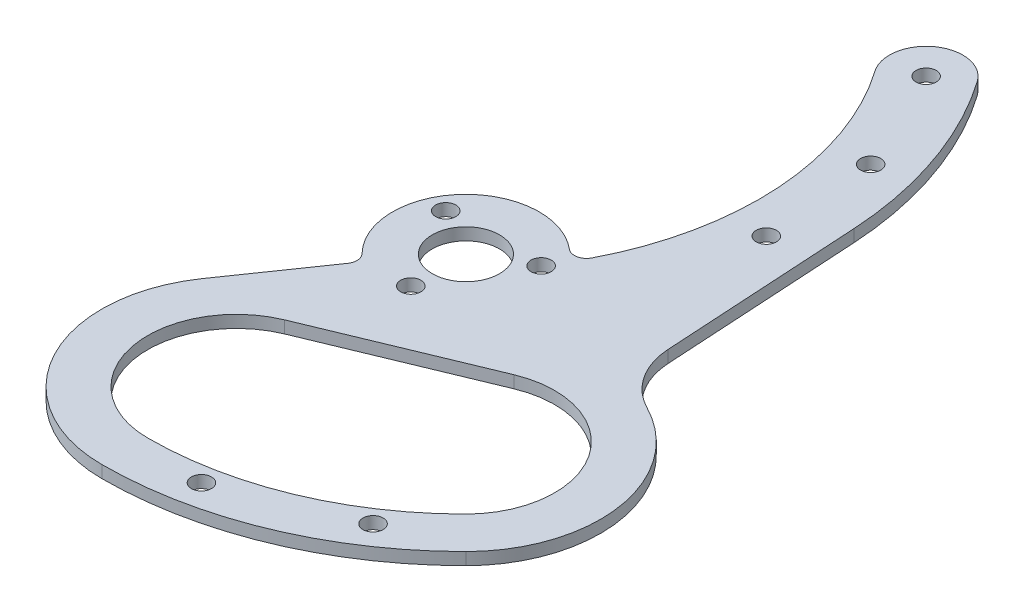
ISO-10303-21;
HEADER;
FILE_DESCRIPTION(('STEP AP214'),'2;1');
FILE_NAME('part.step','',(''),(''),'','','');
FILE_SCHEMA(('AUTOMOTIVE_DESIGN { 1 0 10303 214 1 1 1 1 }'));
ENDSEC;
DATA;
#1=APPLICATION_CONTEXT('core data for automotive mechanical design processes');
#2=APPLICATION_PROTOCOL_DEFINITION('international standard','automotive_design',2000,#1);
#3=PRODUCT_CONTEXT('',#1,'mechanical');
#4=PRODUCT('Part','Part','',(#3));
#5=PRODUCT_RELATED_PRODUCT_CATEGORY('part','',(#4));
#6=PRODUCT_DEFINITION_FORMATION('','',#4);
#7=PRODUCT_DEFINITION_CONTEXT('part definition',#1,'design');
#8=PRODUCT_DEFINITION('design','',#6,#7);
#9=PRODUCT_DEFINITION_SHAPE('','',#8);
#10=(LENGTH_UNIT() NAMED_UNIT(*) SI_UNIT(.MILLI.,.METRE.));
#11=(NAMED_UNIT(*) PLANE_ANGLE_UNIT() SI_UNIT($,.RADIAN.));
#12=(NAMED_UNIT(*) SI_UNIT($,.STERADIAN.) SOLID_ANGLE_UNIT());
#13=UNCERTAINTY_MEASURE_WITH_UNIT(LENGTH_MEASURE(1.E-05),#10,'distance_accuracy_value','');
#14=(GEOMETRIC_REPRESENTATION_CONTEXT(3) GLOBAL_UNCERTAINTY_ASSIGNED_CONTEXT((#13)) GLOBAL_UNIT_ASSIGNED_CONTEXT((#10,
#11,#12)) REPRESENTATION_CONTEXT('',''));
#15=CARTESIAN_POINT('',(0.,0.,0.));
#16=DIRECTION('',(0.,0.,1.));
#17=DIRECTION('',(1.,0.,0.));
#18=AXIS2_PLACEMENT_3D('',#15,#16,#17);
#19=CARTESIAN_POINT('',(12.4144052382109,2.,-62.7929327163513));
#20=DIRECTION('',(0.,-1.,0.));
#21=DIRECTION('',(0.,0.,-1.));
#22=AXIS2_PLACEMENT_3D('',#19,#20,#21);
#23=PLANE('',#22);
#24=CARTESIAN_POINT('',(12.4144052382108,2.,-62.7929327163513));
#25=DIRECTION('',(0.,-1.,0.));
#26=DIRECTION('',(0.,0.,-1.));
#27=AXIS2_PLACEMENT_3D('',#24,#25,#26);
#28=CIRCLE('',#27,1.65000000000008);
#29=CARTESIAN_POINT('',(12.4144052382108,2.,-64.4429327163514));
#30=VERTEX_POINT('',#29);
#31=EDGE_CURVE('E483',#30,#30,#28,.T.);
#32=ORIENTED_EDGE('',*,*,#31,.T.);
#33=EDGE_LOOP('',(#32));
#34=FACE_BOUND('',#33,.T.);
#35=CARTESIAN_POINT('',(20.340189466215,2.,-45.7960335889309));
#36=DIRECTION('',(0.,-1.,0.));
#37=DIRECTION('',(0.,0.,-1.));
#38=AXIS2_PLACEMENT_3D('',#35,#36,#37);
#39=CIRCLE('',#38,1.64999999999996);
#40=CARTESIAN_POINT('',(20.340189466215,2.,-47.4460335889308));
#41=VERTEX_POINT('',#40);
#42=EDGE_CURVE('E488',#41,#41,#39,.T.);
#43=ORIENTED_EDGE('',*,*,#42,.T.);
#44=EDGE_LOOP('',(#43));
#45=FACE_BOUND('',#44,.T.);
#46=CARTESIAN_POINT('',(21.9747085435597,2.,-27.1133950450212));
#47=DIRECTION('',(0.,-1.,0.));
#48=DIRECTION('',(0.,0.,-1.));
#49=AXIS2_PLACEMENT_3D('',#46,#47,#48);
#50=CIRCLE('',#49,1.65);
#51=CARTESIAN_POINT('',(21.9747085435597,2.,-28.7633950450212));
#52=VERTEX_POINT('',#51);
#53=EDGE_CURVE('E443',#52,#52,#50,.T.);
#54=ORIENTED_EDGE('',*,*,#53,.T.);
#55=EDGE_LOOP('',(#54));
#56=FACE_BOUND('',#55,.T.);
#57=CARTESIAN_POINT('',(30.556362816078,2.,45.7308286766401));
#58=DIRECTION('',(0.,1.,0.));
#59=DIRECTION('',(0.,0.,-1.));
#60=AXIS2_PLACEMENT_3D('',#57,#58,#59);
#61=CIRCLE('',#60,1.65);
#62=CARTESIAN_POINT('',(30.556362816078,2.,44.0808286766401));
#63=VERTEX_POINT('',#62);
#64=EDGE_CURVE('E194',#63,#63,#61,.T.);
#65=ORIENTED_EDGE('',*,*,#64,.F.);
#66=EDGE_LOOP('',(#65));
#67=FACE_BOUND('',#66,.T.);
#68=CARTESIAN_POINT('',(10.7299677108873,2.,53.9431904221776));
#69=DIRECTION('',(0.,1.,0.));
#70=DIRECTION('',(0.,0.,1.));
#71=AXIS2_PLACEMENT_3D('',#68,#69,#70);
#72=CIRCLE('',#71,1.65);
#73=CARTESIAN_POINT('',(10.7299677108873,2.,55.5931904221776));
#74=VERTEX_POINT('',#73);
#75=EDGE_CURVE('E200',#74,#74,#72,.T.);
#76=ORIENTED_EDGE('',*,*,#75,.F.);
#77=EDGE_LOOP('',(#76));
#78=FACE_BOUND('',#77,.T.);
#79=CARTESIAN_POINT('',(12.4144052382109,2.,-62.7929327163513));
#80=DIRECTION('',(0.,1.,0.));
#81=DIRECTION('',(0.,0.,-1.));
#82=AXIS2_PLACEMENT_3D('',#79,#80,#81);
#83=CIRCLE('',#82,6.);
#84=CARTESIAN_POINT('',(17.3293175039448,2.,-66.2343913344576));
#85=VERTEX_POINT('',#84);
#86=CARTESIAN_POINT('',(7.49949297247695,2.,-59.351474098245));
#87=VERTEX_POINT('',#86);
#88=EDGE_CURVE('E206',#85,#87,#83,.T.);
#89=ORIENTED_EDGE('',*,*,#88,.T.);
#90=CARTESIAN_POINT('',(-31.8198051533946,2.,-31.8198051533947));
#91=DIRECTION('',(0.,-1.,0.));
#92=DIRECTION('',(0.,0.,-1.));
#93=AXIS2_PLACEMENT_3D('',#90,#91,#92);
#94=CIRCLE('',#93,48.);
#95=CARTESIAN_POINT('',(10.8166216797478,2.,-9.77133339451546));
#96=VERTEX_POINT('',#95);
#97=EDGE_CURVE('E209',#87,#96,#94,.T.);
#98=ORIENTED_EDGE('',*,*,#97,.T.);
#99=CARTESIAN_POINT('',(9.04010389503357,2.,-10.6900197178021));
#100=DIRECTION('',(0.,-1.,0.));
#101=DIRECTION('',(0.,0.,-1.));
#102=AXIS2_PLACEMENT_3D('',#99,#100,#101);
#103=CIRCLE('',#102,2.);
#104=CARTESIAN_POINT('',(7.74866048145734,2.,-9.16287404383036));
#105=VERTEX_POINT('',#104);
#106=EDGE_CURVE('E281',#96,#105,#103,.T.);
#107=ORIENTED_EDGE('',*,*,#106,.T.);
#108=CARTESIAN_POINT('',(0.,2.,0.));
#109=DIRECTION('',(0.,1.,0.));
#110=DIRECTION('',(0.,0.,1.));
#111=AXIS2_PLACEMENT_3D('',#108,#109,#110);
#112=CIRCLE('',#111,12.);
#113=CARTESIAN_POINT('',(-8.57705807279926,2.,8.39250110609631));
#114=VERTEX_POINT('',#113);
#115=EDGE_CURVE('E213',#105,#114,#112,.T.);
#116=ORIENTED_EDGE('',*,*,#115,.T.);
#117=CARTESIAN_POINT('',(-10.0065677515991,2.,9.7912512904457));
#118=DIRECTION('',(0.,-1.,0.));
#119=DIRECTION('',(0.,0.,-1.));
#120=AXIS2_PLACEMENT_3D('',#117,#118,#119);
#121=CIRCLE('',#120,2.);
#122=CARTESIAN_POINT('',(-8.36222213886381,2.,10.9297272479775));
#123=VERTEX_POINT('',#122);
#124=EDGE_CURVE('E277',#114,#123,#121,.T.);
#125=ORIENTED_EDGE('',*,*,#124,.T.);
#126=DIRECTION('',(-0.569237978765922,0.,0.822172806367669));
#127=VECTOR('',#126,1.);
#128=CARTESIAN_POINT('',(-7.35806894846151,2.,9.47938929202116));
#129=LINE('',#128,#127);
#130=CARTESIAN_POINT('',(-18.0878017400887,2.,24.9767644671498));
#131=VERTEX_POINT('',#130);
#132=EDGE_CURVE('E216',#123,#131,#129,.T.);
#133=ORIENTED_EDGE('',*,*,#132,.T.);
#134=CARTESIAN_POINT('',(0.,2.,37.5));
#135=DIRECTION('',(0.,1.,0.));
#136=DIRECTION('',(0.,0.,-1.));
#137=AXIS2_PLACEMENT_3D('',#134,#135,#136);
#138=CIRCLE('',#137,22.);
#139=CARTESIAN_POINT('',(0.,2.,59.5));
#140=VERTEX_POINT('',#139);
#141=EDGE_CURVE('E218',#131,#140,#138,.T.);
#142=ORIENTED_EDGE('',*,*,#141,.T.);
#143=CARTESIAN_POINT('',(0.,2.,0.));
#144=DIRECTION('',(0.,1.,0.));
#145=DIRECTION('',(0.,0.,-1.));
#146=AXIS2_PLACEMENT_3D('',#143,#144,#145);
#147=CIRCLE('',#146,59.5);
#148=CARTESIAN_POINT('',(42.0728534805996,2.,42.0728534805995));
#149=VERTEX_POINT('',#148);
#150=EDGE_CURVE('E220',#140,#149,#147,.T.);
#151=ORIENTED_EDGE('',*,*,#150,.T.);
#152=CARTESIAN_POINT('',(26.5165042944956,2.,26.5165042944955));
#153=DIRECTION('',(0.,1.,0.));
#154=DIRECTION('',(0.,0.,1.));
#155=AXIS2_PLACEMENT_3D('',#152,#153,#154);
#156=CIRCLE('',#155,22.);
#157=CARTESIAN_POINT('',(36.5104743417037,2.,6.91751037400286));
#158=VERTEX_POINT('',#157);
#159=EDGE_CURVE('E222',#149,#158,#156,.T.);
#160=ORIENTED_EDGE('',*,*,#159,.T.);
#161=CARTESIAN_POINT('',(41.9617307310899,2.,-3.77284994626585));
#162=DIRECTION('',(0.,-1.,0.));
#163=DIRECTION('',(0.,0.,-1.));
#164=AXIS2_PLACEMENT_3D('',#161,#162,#163);
#165=CIRCLE('',#164,12.);
#166=CARTESIAN_POINT('',(29.9825963673094,2.,-3.0655028642094));
#167=VERTEX_POINT('',#166);
#168=EDGE_CURVE('E11',#158,#167,#165,.T.);
#169=ORIENTED_EDGE('',*,*,#168,.T.);
#170=DIRECTION('',(-0.0589455901713703,0.,-0.998261196981706));
#171=VECTOR('',#170,1.);
#172=CARTESIAN_POINT('',(30.4512467939954,2.,4.87123225964618));
#173=LINE('',#172,#171);
#174=CARTESIAN_POINT('',(28.0758666655078,2.,-35.3565405636769));
#175=VERTEX_POINT('',#174);
#176=EDGE_CURVE('E224',#167,#175,#173,.T.);
#177=ORIENTED_EDGE('',*,*,#176,.T.);
#178=CARTESIAN_POINT('',(-31.8198051533946,2.,-31.8198051533947));
#179=DIRECTION('',(0.,1.,0.));
#180=DIRECTION('',(0.,0.,-1.));
#181=AXIS2_PLACEMENT_3D('',#178,#179,#180);
#182=CIRCLE('',#181,60.);
#183=EDGE_CURVE('E226',#175,#85,#182,.T.);
#184=ORIENTED_EDGE('',*,*,#183,.T.);
#185=EDGE_LOOP('',(#89,#98,#107,#116,#125,#133,#142,#151,#160,#169,#177,#184));
#186=FACE_BOUND('',#185,.T.);
#187=CARTESIAN_POINT('',(0.,2.,37.5));
#188=DIRECTION('',(0.,1.,0.));
#189=DIRECTION('',(0.,0.,-1.));
#190=AXIS2_PLACEMENT_3D('',#187,#188,#189);
#191=CIRCLE('',#190,14.5);
#192=CARTESIAN_POINT('',(-5.54890976929381,2.,24.1037467785863));
#193=VERTEX_POINT('',#192);
#194=CARTESIAN_POINT('',(0.,2.,52.));
#195=VERTEX_POINT('',#194);
#196=EDGE_CURVE('E150',#193,#195,#191,.T.);
#197=ORIENTED_EDGE('',*,*,#196,.F.);
#198=DIRECTION('',(-0.923879532511287,0.,0.38268343236509));
#199=VECTOR('',#198,1.);
#200=CARTESIAN_POINT('',(-5.54890976929381,2.,24.1037467785863));
#201=LINE('',#200,#199);
#202=CARTESIAN_POINT('',(20.9675945252018,2.,13.1202510730819));
#203=VERTEX_POINT('',#202);
#204=EDGE_CURVE('E176',#203,#193,#201,.T.);
#205=ORIENTED_EDGE('',*,*,#204,.F.);
#206=CARTESIAN_POINT('',(26.5165042944956,2.,26.5165042944955));
#207=DIRECTION('',(0.,1.,0.));
#208=DIRECTION('',(0.,0.,1.));
#209=AXIS2_PLACEMENT_3D('',#206,#207,#208);
#210=CIRCLE('',#209,14.5);
#211=CARTESIAN_POINT('',(36.7695526217005,2.,36.7695526217004));
#212=VERTEX_POINT('',#211);
#213=EDGE_CURVE('E174',#212,#203,#210,.T.);
#214=ORIENTED_EDGE('',*,*,#213,.F.);
#215=CARTESIAN_POINT('',(0.,2.,0.));
#216=DIRECTION('',(0.,1.,0.));
#217=DIRECTION('',(0.,0.,1.));
#218=AXIS2_PLACEMENT_3D('',#215,#216,#217);
#219=CIRCLE('',#218,52.);
#220=EDGE_CURVE('E160',#195,#212,#219,.T.);
#221=ORIENTED_EDGE('',*,*,#220,.F.);
#222=EDGE_LOOP('',(#197,#205,#214,#221));
#223=FACE_BOUND('',#222,.T.);
#224=CARTESIAN_POINT('',(0.,2.,0.));
#225=DIRECTION('',(0.,1.,0.));
#226=DIRECTION('',(0.,0.,1.));
#227=AXIS2_PLACEMENT_3D('',#224,#225,#226);
#228=CIRCLE('',#227,5.5);
#229=CARTESIAN_POINT('',(0.,2.,5.5));
#230=VERTEX_POINT('',#229);
#231=EDGE_CURVE('E183',#230,#230,#228,.T.);
#232=ORIENTED_EDGE('',*,*,#231,.F.);
#233=EDGE_LOOP('',(#232));
#234=FACE_BOUND('',#233,.T.);
#235=CARTESIAN_POINT('',(0.,2.,9.));
#236=DIRECTION('',(0.,1.,0.));
#237=DIRECTION('',(0.,0.,1.));
#238=AXIS2_PLACEMENT_3D('',#235,#236,#237);
#239=CIRCLE('',#238,1.65);
#240=CARTESIAN_POINT('',(0.,2.,10.65));
#241=VERTEX_POINT('',#240);
#242=EDGE_CURVE('E458',#241,#241,#239,.T.);
#243=ORIENTED_EDGE('',*,*,#242,.F.);
#244=EDGE_LOOP('',(#243));
#245=FACE_BOUND('',#244,.T.);
#246=CARTESIAN_POINT('',(-7.79422863405996,2.,-4.49999999999998));
#247=DIRECTION('',(0.,1.,0.));
#248=DIRECTION('',(0.,0.,1.));
#249=AXIS2_PLACEMENT_3D('',#246,#247,#248);
#250=CIRCLE('',#249,1.65);
#251=CARTESIAN_POINT('',(-7.79422863405996,2.,-2.84999999999998));
#252=VERTEX_POINT('',#251);
#253=EDGE_CURVE('E453',#252,#252,#250,.T.);
#254=ORIENTED_EDGE('',*,*,#253,.F.);
#255=EDGE_LOOP('',(#254));
#256=FACE_BOUND('',#255,.T.);
#257=CARTESIAN_POINT('',(7.79422863405996,2.,-4.49999999999998));
#258=DIRECTION('',(0.,1.,0.));
#259=DIRECTION('',(0.,0.,1.));
#260=AXIS2_PLACEMENT_3D('',#257,#258,#259);
#261=CIRCLE('',#260,1.65);
#262=CARTESIAN_POINT('',(7.79422863405996,2.,-2.84999999999999));
#263=VERTEX_POINT('',#262);
#264=EDGE_CURVE('E442',#263,#263,#261,.T.);
#265=ORIENTED_EDGE('',*,*,#264,.F.);
#266=EDGE_LOOP('',(#265));
#267=FACE_BOUND('',#266,.T.);
#268=ADVANCED_FACE('F36',(#34,#45,#56,#67,#78,#186,#223,#234,#245,#256,#267),#23,.F.);
#269=CARTESIAN_POINT('',(12.4144052382109,0.,-62.7929327163513));
#270=DIRECTION('',(0.,-1.,0.));
#271=DIRECTION('',(0.,0.,-1.));
#272=AXIS2_PLACEMENT_3D('',#269,#270,#271);
#273=PLANE('',#272);
#274=CARTESIAN_POINT('',(12.4144052382108,0.,-62.7929327163513));
#275=DIRECTION('',(0.,-1.,0.));
#276=DIRECTION('',(0.,0.,-1.));
#277=AXIS2_PLACEMENT_3D('',#274,#275,#276);
#278=CIRCLE('',#277,1.65000000000008);
#279=CARTESIAN_POINT('',(12.4144052382108,0.,-64.4429327163514));
#280=VERTEX_POINT('',#279);
#281=EDGE_CURVE('E491',#280,#280,#278,.T.);
#282=ORIENTED_EDGE('',*,*,#281,.F.);
#283=EDGE_LOOP('',(#282));
#284=FACE_BOUND('',#283,.T.);
#285=CARTESIAN_POINT('',(20.340189466215,0.,-45.7960335889309));
#286=DIRECTION('',(0.,-1.,0.));
#287=DIRECTION('',(0.,0.,-1.));
#288=AXIS2_PLACEMENT_3D('',#285,#286,#287);
#289=CIRCLE('',#288,1.64999999999996);
#290=CARTESIAN_POINT('',(20.340189466215,0.,-47.4460335889308));
#291=VERTEX_POINT('',#290);
#292=EDGE_CURVE('E485',#291,#291,#289,.T.);
#293=ORIENTED_EDGE('',*,*,#292,.F.);
#294=EDGE_LOOP('',(#293));
#295=FACE_BOUND('',#294,.T.);
#296=CARTESIAN_POINT('',(21.9747085435597,0.,-27.1133950450212));
#297=DIRECTION('',(0.,-1.,0.));
#298=DIRECTION('',(0.,0.,-1.));
#299=AXIS2_PLACEMENT_3D('',#296,#297,#298);
#300=CIRCLE('',#299,1.65);
#301=CARTESIAN_POINT('',(21.9747085435597,0.,-28.7633950450212));
#302=VERTEX_POINT('',#301);
#303=EDGE_CURVE('E449',#302,#302,#300,.T.);
#304=ORIENTED_EDGE('',*,*,#303,.F.);
#305=EDGE_LOOP('',(#304));
#306=FACE_BOUND('',#305,.T.);
#307=CARTESIAN_POINT('',(-7.79422863405996,0.,-4.49999999999998));
#308=DIRECTION('',(0.,1.,0.));
#309=DIRECTION('',(0.,0.,1.));
#310=AXIS2_PLACEMENT_3D('',#307,#308,#309);
#311=CIRCLE('',#310,1.65);
#312=CARTESIAN_POINT('',(-7.79422863405996,0.,-2.84999999999998));
#313=VERTEX_POINT('',#312);
#314=EDGE_CURVE('E446',#313,#313,#311,.T.);
#315=ORIENTED_EDGE('',*,*,#314,.T.);
#316=EDGE_LOOP('',(#315));
#317=FACE_BOUND('',#316,.T.);
#318=CARTESIAN_POINT('',(0.,0.,0.));
#319=DIRECTION('',(0.,1.,0.));
#320=DIRECTION('',(0.,0.,1.));
#321=AXIS2_PLACEMENT_3D('',#318,#319,#320);
#322=CIRCLE('',#321,5.5);
#323=CARTESIAN_POINT('',(0.,0.,5.5));
#324=VERTEX_POINT('',#323);
#325=EDGE_CURVE('E461',#324,#324,#322,.T.);
#326=ORIENTED_EDGE('',*,*,#325,.T.);
#327=EDGE_LOOP('',(#326));
#328=FACE_BOUND('',#327,.T.);
#329=CARTESIAN_POINT('',(10.7299677108873,0.,53.9431904221776));
#330=DIRECTION('',(0.,1.,0.));
#331=DIRECTION('',(0.,0.,1.));
#332=AXIS2_PLACEMENT_3D('',#329,#330,#331);
#333=CIRCLE('',#332,1.65);
#334=CARTESIAN_POINT('',(10.7299677108873,0.,55.5931904221776));
#335=VERTEX_POINT('',#334);
#336=EDGE_CURVE('E197',#335,#335,#333,.T.);
#337=ORIENTED_EDGE('',*,*,#336,.T.);
#338=EDGE_LOOP('',(#337));
#339=FACE_BOUND('',#338,.T.);
#340=CARTESIAN_POINT('',(12.4144052382109,0.,-62.7929327163513));
#341=DIRECTION('',(0.,1.,0.));
#342=DIRECTION('',(0.,0.,-1.));
#343=AXIS2_PLACEMENT_3D('',#340,#341,#342);
#344=CIRCLE('',#343,6.);
#345=CARTESIAN_POINT('',(17.3293175039448,0.,-66.2343913344576));
#346=VERTEX_POINT('',#345);
#347=CARTESIAN_POINT('',(7.49949297247695,0.,-59.351474098245));
#348=VERTEX_POINT('',#347);
#349=EDGE_CURVE('E203',#346,#348,#344,.T.);
#350=ORIENTED_EDGE('',*,*,#349,.F.);
#351=CARTESIAN_POINT('',(-31.8198051533946,0.,-31.8198051533947));
#352=DIRECTION('',(0.,1.,0.));
#353=DIRECTION('',(0.,0.,-1.));
#354=AXIS2_PLACEMENT_3D('',#351,#352,#353);
#355=CIRCLE('',#354,60.);
#356=CARTESIAN_POINT('',(28.0758666655078,0.,-35.3565405636769));
#357=VERTEX_POINT('',#356);
#358=EDGE_CURVE('E210',#357,#346,#355,.T.);
#359=ORIENTED_EDGE('',*,*,#358,.F.);
#360=DIRECTION('',(-0.0589455901713703,0.,-0.998261196981706));
#361=VECTOR('',#360,1.);
#362=CARTESIAN_POINT('',(30.4512467939954,0.,4.87123225964618));
#363=LINE('',#362,#361);
#364=CARTESIAN_POINT('',(29.9825963673094,0.,-3.0655028642094));
#365=VERTEX_POINT('',#364);
#366=EDGE_CURVE('E245',#365,#357,#363,.T.);
#367=ORIENTED_EDGE('',*,*,#366,.F.);
#368=CARTESIAN_POINT('',(41.9617307310899,0.,-3.77284994626585));
#369=DIRECTION('',(0.,-1.,0.));
#370=DIRECTION('',(0.,0.,-1.));
#371=AXIS2_PLACEMENT_3D('',#368,#369,#370);
#372=CIRCLE('',#371,12.);
#373=CARTESIAN_POINT('',(36.5104743417037,0.,6.91751037400286));
#374=VERTEX_POINT('',#373);
#375=EDGE_CURVE('E44',#365,#374,#372,.F.);
#376=ORIENTED_EDGE('',*,*,#375,.T.);
#377=CARTESIAN_POINT('',(26.5165042944956,0.,26.5165042944955));
#378=DIRECTION('',(0.,1.,0.));
#379=DIRECTION('',(0.,0.,1.));
#380=AXIS2_PLACEMENT_3D('',#377,#378,#379);
#381=CIRCLE('',#380,22.);
#382=CARTESIAN_POINT('',(42.0728534805996,0.,42.0728534805995));
#383=VERTEX_POINT('',#382);
#384=EDGE_CURVE('E243',#383,#374,#381,.T.);
#385=ORIENTED_EDGE('',*,*,#384,.F.);
#386=CARTESIAN_POINT('',(0.,0.,0.));
#387=DIRECTION('',(0.,1.,0.));
#388=DIRECTION('',(0.,0.,-1.));
#389=AXIS2_PLACEMENT_3D('',#386,#387,#388);
#390=CIRCLE('',#389,59.5);
#391=CARTESIAN_POINT('',(0.,0.,59.5));
#392=VERTEX_POINT('',#391);
#393=EDGE_CURVE('E241',#392,#383,#390,.T.);
#394=ORIENTED_EDGE('',*,*,#393,.F.);
#395=CARTESIAN_POINT('',(0.,0.,37.5));
#396=DIRECTION('',(0.,1.,0.));
#397=DIRECTION('',(0.,0.,-1.));
#398=AXIS2_PLACEMENT_3D('',#395,#396,#397);
#399=CIRCLE('',#398,22.);
#400=CARTESIAN_POINT('',(-18.0878017400887,0.,24.9767644671498));
#401=VERTEX_POINT('',#400);
#402=EDGE_CURVE('E239',#401,#392,#399,.T.);
#403=ORIENTED_EDGE('',*,*,#402,.F.);
#404=DIRECTION('',(-0.569237978765922,0.,0.822172806367669));
#405=VECTOR('',#404,1.);
#406=CARTESIAN_POINT('',(-7.35806894846151,0.,9.47938929202116));
#407=LINE('',#406,#405);
#408=CARTESIAN_POINT('',(-8.36222213886381,0.,10.9297272479775));
#409=VERTEX_POINT('',#408);
#410=EDGE_CURVE('E237',#409,#401,#407,.T.);
#411=ORIENTED_EDGE('',*,*,#410,.F.);
#412=CARTESIAN_POINT('',(-10.0065677515991,0.,9.7912512904457));
#413=DIRECTION('',(0.,-1.,0.));
#414=DIRECTION('',(0.,0.,-1.));
#415=AXIS2_PLACEMENT_3D('',#412,#413,#414);
#416=CIRCLE('',#415,2.);
#417=CARTESIAN_POINT('',(-8.57705807279926,0.,8.39250110609631));
#418=VERTEX_POINT('',#417);
#419=EDGE_CURVE('E275',#409,#418,#416,.F.);
#420=ORIENTED_EDGE('',*,*,#419,.T.);
#421=CARTESIAN_POINT('',(0.,0.,0.));
#422=DIRECTION('',(0.,1.,0.));
#423=DIRECTION('',(0.,0.,1.));
#424=AXIS2_PLACEMENT_3D('',#421,#422,#423);
#425=CIRCLE('',#424,12.);
#426=CARTESIAN_POINT('',(7.74866048145734,0.,-9.16287404383036));
#427=VERTEX_POINT('',#426);
#428=EDGE_CURVE('E234',#427,#418,#425,.T.);
#429=ORIENTED_EDGE('',*,*,#428,.F.);
#430=CARTESIAN_POINT('',(9.04010389503357,0.,-10.6900197178021));
#431=DIRECTION('',(0.,-1.,0.));
#432=DIRECTION('',(0.,0.,-1.));
#433=AXIS2_PLACEMENT_3D('',#430,#431,#432);
#434=CIRCLE('',#433,2.);
#435=CARTESIAN_POINT('',(10.8166216797478,0.,-9.77133339451546));
#436=VERTEX_POINT('',#435);
#437=EDGE_CURVE('E279',#427,#436,#434,.F.);
#438=ORIENTED_EDGE('',*,*,#437,.T.);
#439=CARTESIAN_POINT('',(-31.8198051533946,0.,-31.8198051533947));
#440=DIRECTION('',(0.,-1.,0.));
#441=DIRECTION('',(0.,0.,-1.));
#442=AXIS2_PLACEMENT_3D('',#439,#440,#441);
#443=CIRCLE('',#442,48.);
#444=EDGE_CURVE('E231',#348,#436,#443,.T.);
#445=ORIENTED_EDGE('',*,*,#444,.F.);
#446=EDGE_LOOP('',(#350,#359,#367,#376,#385,#394,#403,#411,#420,#429,#438,#445));
#447=FACE_BOUND('',#446,.T.);
#448=CARTESIAN_POINT('',(30.556362816078,0.,45.7308286766401));
#449=DIRECTION('',(0.,1.,0.));
#450=DIRECTION('',(0.,0.,-1.));
#451=AXIS2_PLACEMENT_3D('',#448,#449,#450);
#452=CIRCLE('',#451,1.65);
#453=CARTESIAN_POINT('',(30.556362816078,0.,44.0808286766401));
#454=VERTEX_POINT('',#453);
#455=EDGE_CURVE('E168',#454,#454,#452,.T.);
#456=ORIENTED_EDGE('',*,*,#455,.T.);
#457=EDGE_LOOP('',(#456));
#458=FACE_BOUND('',#457,.T.);
#459=DIRECTION('',(-0.923879532511287,0.,0.38268343236509));
#460=VECTOR('',#459,1.);
#461=CARTESIAN_POINT('',(-5.54890976929381,0.,24.1037467785863));
#462=LINE('',#461,#460);
#463=CARTESIAN_POINT('',(20.9675945252018,0.,13.1202510730818));
#464=VERTEX_POINT('',#463);
#465=CARTESIAN_POINT('',(-5.54890976929381,0.,24.1037467785864));
#466=VERTEX_POINT('',#465);
#467=EDGE_CURVE('E161',#464,#466,#462,.T.);
#468=ORIENTED_EDGE('',*,*,#467,.T.);
#469=CARTESIAN_POINT('',(0.,0.,37.5));
#470=DIRECTION('',(0.,1.,0.));
#471=DIRECTION('',(0.,0.,-1.));
#472=AXIS2_PLACEMENT_3D('',#469,#470,#471);
#473=CIRCLE('',#472,14.5);
#474=CARTESIAN_POINT('',(0.,0.,52.));
#475=VERTEX_POINT('',#474);
#476=EDGE_CURVE('E181',#466,#475,#473,.T.);
#477=ORIENTED_EDGE('',*,*,#476,.T.);
#478=CARTESIAN_POINT('',(0.,0.,0.));
#479=DIRECTION('',(0.,1.,0.));
#480=DIRECTION('',(0.,0.,1.));
#481=AXIS2_PLACEMENT_3D('',#478,#479,#480);
#482=CIRCLE('',#481,52.);
#483=CARTESIAN_POINT('',(36.7695526217005,0.,36.7695526217004));
#484=VERTEX_POINT('',#483);
#485=EDGE_CURVE('E167',#475,#484,#482,.T.);
#486=ORIENTED_EDGE('',*,*,#485,.T.);
#487=CARTESIAN_POINT('',(26.5165042944956,0.,26.5165042944955));
#488=DIRECTION('',(0.,1.,0.));
#489=DIRECTION('',(0.,0.,1.));
#490=AXIS2_PLACEMENT_3D('',#487,#488,#489);
#491=CIRCLE('',#490,14.5);
#492=EDGE_CURVE('E185',#484,#464,#491,.T.);
#493=ORIENTED_EDGE('',*,*,#492,.T.);
#494=EDGE_LOOP('',(#468,#477,#486,#493));
#495=FACE_BOUND('',#494,.T.);
#496=CARTESIAN_POINT('',(0.,0.,9.));
#497=DIRECTION('',(0.,1.,0.));
#498=DIRECTION('',(0.,0.,1.));
#499=AXIS2_PLACEMENT_3D('',#496,#497,#498);
#500=CIRCLE('',#499,1.65);
#501=CARTESIAN_POINT('',(0.,0.,10.65));
#502=VERTEX_POINT('',#501);
#503=EDGE_CURVE('E437',#502,#502,#500,.T.);
#504=ORIENTED_EDGE('',*,*,#503,.T.);
#505=EDGE_LOOP('',(#504));
#506=FACE_BOUND('',#505,.T.);
#507=CARTESIAN_POINT('',(7.79422863405996,0.,-4.49999999999998));
#508=DIRECTION('',(0.,1.,0.));
#509=DIRECTION('',(0.,0.,1.));
#510=AXIS2_PLACEMENT_3D('',#507,#508,#509);
#511=CIRCLE('',#510,1.65);
#512=CARTESIAN_POINT('',(7.79422863405996,0.,-2.84999999999999));
#513=VERTEX_POINT('',#512);
#514=EDGE_CURVE('E440',#513,#513,#511,.T.);
#515=ORIENTED_EDGE('',*,*,#514,.T.);
#516=EDGE_LOOP('',(#515));
#517=FACE_BOUND('',#516,.T.);
#518=ADVANCED_FACE('F295',(#284,#295,#306,#317,#328,#339,#447,#458,#495,#506,#517),#273,.T.);
#519=CARTESIAN_POINT('',(12.4144052382109,2.,-62.7929327163513));
#520=DIRECTION('',(0.,-1.,0.));
#521=DIRECTION('',(0.,0.,-1.));
#522=AXIS2_PLACEMENT_3D('',#519,#520,#521);
#523=CYLINDRICAL_SURFACE('',#522,6.);
#524=ORIENTED_EDGE('',*,*,#349,.T.);
#525=DIRECTION('',(0.,-1.,0.));
#526=VECTOR('',#525,1.);
#527=CARTESIAN_POINT('',(7.49949297247695,2.,-59.351474098245));
#528=LINE('',#527,#526);
#529=EDGE_CURVE('E262',#87,#348,#528,.T.);
#530=ORIENTED_EDGE('',*,*,#529,.F.);
#531=ORIENTED_EDGE('',*,*,#88,.F.);
#532=DIRECTION('',(0.,-1.,0.));
#533=VECTOR('',#532,1.);
#534=CARTESIAN_POINT('',(17.3293175039448,2.,-66.2343913344576));
#535=LINE('',#534,#533);
#536=EDGE_CURVE('E228',#85,#346,#535,.T.);
#537=ORIENTED_EDGE('',*,*,#536,.T.);
#538=EDGE_LOOP('',(#524,#530,#531,#537));
#539=FACE_BOUND('',#538,.T.);
#540=ADVANCED_FACE('F303',(#539),#523,.T.);
#541=CARTESIAN_POINT('',(-31.8198051533946,2.,-31.8198051533947));
#542=DIRECTION('',(0.,-1.,0.));
#543=DIRECTION('',(0.,0.,-1.));
#544=AXIS2_PLACEMENT_3D('',#541,#542,#543);
#545=CYLINDRICAL_SURFACE('',#544,48.);
#546=ORIENTED_EDGE('',*,*,#444,.T.);
#547=DIRECTION('',(0.,-1.,0.));
#548=VECTOR('',#547,1.);
#549=CARTESIAN_POINT('',(10.8166216797478,2.,-9.77133339451546));
#550=LINE('',#549,#548);
#551=EDGE_CURVE('E273',#436,#96,#550,.F.);
#552=ORIENTED_EDGE('',*,*,#551,.T.);
#553=ORIENTED_EDGE('',*,*,#97,.F.);
#554=ORIENTED_EDGE('',*,*,#529,.T.);
#555=EDGE_LOOP('',(#546,#552,#553,#554));
#556=FACE_BOUND('',#555,.T.);
#557=ADVANCED_FACE('F350',(#556),#545,.F.);
#558=CARTESIAN_POINT('',(0.,2.,0.));
#559=DIRECTION('',(0.,-1.,0.));
#560=DIRECTION('',(0.,0.,-1.));
#561=AXIS2_PLACEMENT_3D('',#558,#559,#560);
#562=CYLINDRICAL_SURFACE('',#561,12.);
#563=ORIENTED_EDGE('',*,*,#428,.T.);
#564=DIRECTION('',(0.,-1.,0.));
#565=VECTOR('',#564,1.);
#566=CARTESIAN_POINT('',(-8.57705807279926,2.,8.39250110609631));
#567=LINE('',#566,#565);
#568=EDGE_CURVE('E271',#418,#114,#567,.F.);
#569=ORIENTED_EDGE('',*,*,#568,.T.);
#570=ORIENTED_EDGE('',*,*,#115,.F.);
#571=DIRECTION('',(0.,-1.,0.));
#572=VECTOR('',#571,1.);
#573=CARTESIAN_POINT('',(7.74866048145734,2.,-9.16287404383036));
#574=LINE('',#573,#572);
#575=EDGE_CURVE('E268',#105,#427,#574,.T.);
#576=ORIENTED_EDGE('',*,*,#575,.T.);
#577=EDGE_LOOP('',(#563,#569,#570,#576));
#578=FACE_BOUND('',#577,.T.);
#579=ADVANCED_FACE('F346',(#578),#562,.T.);
#580=CARTESIAN_POINT('',(-7.35806894846151,2.,9.47938929202116));
#581=DIRECTION('',(0.822172806367669,0.,0.569237978765922));
#582=DIRECTION('',(0.569237978765922,0.,-0.822172806367669));
#583=AXIS2_PLACEMENT_3D('',#580,#581,#582);
#584=PLANE('',#583);
#585=ORIENTED_EDGE('',*,*,#132,.F.);
#586=DIRECTION('',(0.,1.,0.));
#587=VECTOR('',#586,1.);
#588=CARTESIAN_POINT('',(-8.36222213886381,0.,10.9297272479775));
#589=LINE('',#588,#587);
#590=EDGE_CURVE('E265',#123,#409,#589,.F.);
#591=ORIENTED_EDGE('',*,*,#590,.T.);
#592=ORIENTED_EDGE('',*,*,#410,.T.);
#593=DIRECTION('',(0.,-1.,0.));
#594=VECTOR('',#593,1.);
#595=CARTESIAN_POINT('',(-18.0878017400887,2.,24.9767644671498));
#596=LINE('',#595,#594);
#597=EDGE_CURVE('E259',#131,#401,#596,.T.);
#598=ORIENTED_EDGE('',*,*,#597,.F.);
#599=EDGE_LOOP('',(#585,#591,#592,#598));
#600=FACE_BOUND('',#599,.T.);
#601=ADVANCED_FACE('F342',(#600),#584,.F.);
#602=CARTESIAN_POINT('',(0.,2.,37.5));
#603=DIRECTION('',(0.,-1.,0.));
#604=DIRECTION('',(0.,0.,-1.));
#605=AXIS2_PLACEMENT_3D('',#602,#603,#604);
#606=CYLINDRICAL_SURFACE('',#605,22.);
#607=ORIENTED_EDGE('',*,*,#402,.T.);
#608=DIRECTION('',(0.,-1.,0.));
#609=VECTOR('',#608,1.);
#610=CARTESIAN_POINT('',(0.,2.,59.5));
#611=LINE('',#610,#609);
#612=EDGE_CURVE('E256',#140,#392,#611,.T.);
#613=ORIENTED_EDGE('',*,*,#612,.F.);
#614=ORIENTED_EDGE('',*,*,#141,.F.);
#615=ORIENTED_EDGE('',*,*,#597,.T.);
#616=EDGE_LOOP('',(#607,#613,#614,#615));
#617=FACE_BOUND('',#616,.T.);
#618=ADVANCED_FACE('F338',(#617),#606,.T.);
#619=CARTESIAN_POINT('',(0.,2.,0.));
#620=DIRECTION('',(0.,-1.,0.));
#621=DIRECTION('',(0.,0.,-1.));
#622=AXIS2_PLACEMENT_3D('',#619,#620,#621);
#623=CYLINDRICAL_SURFACE('',#622,59.5);
#624=ORIENTED_EDGE('',*,*,#393,.T.);
#625=DIRECTION('',(0.,-1.,0.));
#626=VECTOR('',#625,1.);
#627=CARTESIAN_POINT('',(42.0728534805996,2.,42.0728534805995));
#628=LINE('',#627,#626);
#629=EDGE_CURVE('E253',#149,#383,#628,.T.);
#630=ORIENTED_EDGE('',*,*,#629,.F.);
#631=ORIENTED_EDGE('',*,*,#150,.F.);
#632=ORIENTED_EDGE('',*,*,#612,.T.);
#633=EDGE_LOOP('',(#624,#630,#631,#632));
#634=FACE_BOUND('',#633,.T.);
#635=ADVANCED_FACE('F335',(#634),#623,.T.);
#636=CARTESIAN_POINT('',(26.5165042944956,2.,26.5165042944955));
#637=DIRECTION('',(0.,-1.,0.));
#638=DIRECTION('',(0.,0.,-1.));
#639=AXIS2_PLACEMENT_3D('',#636,#637,#638);
#640=CYLINDRICAL_SURFACE('',#639,22.);
#641=ORIENTED_EDGE('',*,*,#384,.T.);
#642=DIRECTION('',(0.,-1.,0.));
#643=VECTOR('',#642,1.);
#644=CARTESIAN_POINT('',(36.5104743417037,2.,6.91751037400286));
#645=LINE('',#644,#643);
#646=EDGE_CURVE('E51',#374,#158,#645,.F.);
#647=ORIENTED_EDGE('',*,*,#646,.T.);
#648=ORIENTED_EDGE('',*,*,#159,.F.);
#649=ORIENTED_EDGE('',*,*,#629,.T.);
#650=EDGE_LOOP('',(#641,#647,#648,#649));
#651=FACE_BOUND('',#650,.T.);
#652=ADVANCED_FACE('F332',(#651),#640,.T.);
#653=CARTESIAN_POINT('',(30.4512467939954,2.,4.87123225964618));
#654=DIRECTION('',(-0.998261196981706,0.,0.0589455901713703));
#655=DIRECTION('',(0.0589455901713703,0.,0.998261196981706));
#656=AXIS2_PLACEMENT_3D('',#653,#654,#655);
#657=PLANE('',#656);
#658=ORIENTED_EDGE('',*,*,#176,.F.);
#659=DIRECTION('',(0.,1.,0.));
#660=VECTOR('',#659,1.);
#661=CARTESIAN_POINT('',(29.9825963673094,0.,-3.0655028642094));
#662=LINE('',#661,#660);
#663=EDGE_CURVE('E283',#167,#365,#662,.F.);
#664=ORIENTED_EDGE('',*,*,#663,.T.);
#665=ORIENTED_EDGE('',*,*,#366,.T.);
#666=DIRECTION('',(0.,-1.,0.));
#667=VECTOR('',#666,1.);
#668=CARTESIAN_POINT('',(28.0758666655078,2.,-35.3565405636769));
#669=LINE('',#668,#667);
#670=EDGE_CURVE('E250',#175,#357,#669,.T.);
#671=ORIENTED_EDGE('',*,*,#670,.F.);
#672=EDGE_LOOP('',(#658,#664,#665,#671));
#673=FACE_BOUND('',#672,.T.);
#674=ADVANCED_FACE('F289',(#673),#657,.F.);
#675=CARTESIAN_POINT('',(-31.8198051533946,2.,-31.8198051533947));
#676=DIRECTION('',(0.,-1.,0.));
#677=DIRECTION('',(0.,0.,-1.));
#678=AXIS2_PLACEMENT_3D('',#675,#676,#677);
#679=CYLINDRICAL_SURFACE('',#678,60.);
#680=ORIENTED_EDGE('',*,*,#358,.T.);
#681=ORIENTED_EDGE('',*,*,#536,.F.);
#682=ORIENTED_EDGE('',*,*,#183,.F.);
#683=ORIENTED_EDGE('',*,*,#670,.T.);
#684=EDGE_LOOP('',(#680,#681,#682,#683));
#685=FACE_BOUND('',#684,.T.);
#686=ADVANCED_FACE('F299',(#685),#679,.T.);
#687=CARTESIAN_POINT('',(10.7299677108873,2.,53.9431904221776));
#688=DIRECTION('',(0.,-1.,0.));
#689=DIRECTION('',(0.,0.,-1.));
#690=AXIS2_PLACEMENT_3D('',#687,#688,#689);
#691=CYLINDRICAL_SURFACE('',#690,1.65);
#692=ORIENTED_EDGE('',*,*,#75,.T.);
#693=EDGE_LOOP('',(#692));
#694=FACE_BOUND('',#693,.T.);
#695=ORIENTED_EDGE('',*,*,#336,.F.);
#696=EDGE_LOOP('',(#695));
#697=FACE_BOUND('',#696,.T.);
#698=ADVANCED_FACE('F325',(#694,#697),#691,.F.);
#699=CARTESIAN_POINT('',(30.556362816078,2.,45.7308286766401));
#700=DIRECTION('',(0.,-1.,0.));
#701=DIRECTION('',(0.,0.,-1.));
#702=AXIS2_PLACEMENT_3D('',#699,#700,#701);
#703=CYLINDRICAL_SURFACE('',#702,1.65);
#704=ORIENTED_EDGE('',*,*,#64,.T.);
#705=EDGE_LOOP('',(#704));
#706=FACE_BOUND('',#705,.T.);
#707=ORIENTED_EDGE('',*,*,#455,.F.);
#708=EDGE_LOOP('',(#707));
#709=FACE_BOUND('',#708,.T.);
#710=ADVANCED_FACE('F421',(#706,#709),#703,.F.);
#711=CARTESIAN_POINT('',(0.,2.,37.5));
#712=DIRECTION('',(0.,-1.,0.));
#713=DIRECTION('',(0.,0.,-1.));
#714=AXIS2_PLACEMENT_3D('',#711,#712,#713);
#715=CYLINDRICAL_SURFACE('',#714,14.5);
#716=ORIENTED_EDGE('',*,*,#476,.F.);
#717=DIRECTION('',(0.,-1.,0.));
#718=VECTOR('',#717,1.);
#719=CARTESIAN_POINT('',(-5.54890976929381,2.,24.1037467785863));
#720=LINE('',#719,#718);
#721=EDGE_CURVE('E156',#193,#466,#720,.T.);
#722=ORIENTED_EDGE('',*,*,#721,.F.);
#723=ORIENTED_EDGE('',*,*,#196,.T.);
#724=DIRECTION('',(0.,-1.,0.));
#725=VECTOR('',#724,1.);
#726=CARTESIAN_POINT('',(0.,2.,52.));
#727=LINE('',#726,#725);
#728=EDGE_CURVE('E153',#195,#475,#727,.T.);
#729=ORIENTED_EDGE('',*,*,#728,.T.);
#730=EDGE_LOOP('',(#716,#722,#723,#729));
#731=FACE_BOUND('',#730,.T.);
#732=ADVANCED_FACE('F152',(#731),#715,.F.);
#733=CARTESIAN_POINT('',(0.,2.,0.));
#734=DIRECTION('',(0.,-1.,0.));
#735=DIRECTION('',(0.,0.,-1.));
#736=AXIS2_PLACEMENT_3D('',#733,#734,#735);
#737=CYLINDRICAL_SURFACE('',#736,52.);
#738=ORIENTED_EDGE('',*,*,#485,.F.);
#739=ORIENTED_EDGE('',*,*,#728,.F.);
#740=ORIENTED_EDGE('',*,*,#220,.T.);
#741=DIRECTION('',(0.,-1.,0.));
#742=VECTOR('',#741,1.);
#743=CARTESIAN_POINT('',(36.7695526217005,2.,36.7695526217004));
#744=LINE('',#743,#742);
#745=EDGE_CURVE('E169',#212,#484,#744,.T.);
#746=ORIENTED_EDGE('',*,*,#745,.T.);
#747=EDGE_LOOP('',(#738,#739,#740,#746));
#748=FACE_BOUND('',#747,.T.);
#749=ADVANCED_FACE('F164',(#748),#737,.F.);
#750=CARTESIAN_POINT('',(26.5165042944956,2.,26.5165042944955));
#751=DIRECTION('',(0.,-1.,0.));
#752=DIRECTION('',(0.,0.,-1.));
#753=AXIS2_PLACEMENT_3D('',#750,#751,#752);
#754=CYLINDRICAL_SURFACE('',#753,14.5);
#755=ORIENTED_EDGE('',*,*,#492,.F.);
#756=ORIENTED_EDGE('',*,*,#745,.F.);
#757=ORIENTED_EDGE('',*,*,#213,.T.);
#758=DIRECTION('',(0.,-1.,0.));
#759=VECTOR('',#758,1.);
#760=CARTESIAN_POINT('',(20.9675945252018,2.,13.1202510730818));
#761=LINE('',#760,#759);
#762=EDGE_CURVE('E191',#203,#464,#761,.T.);
#763=ORIENTED_EDGE('',*,*,#762,.T.);
#764=EDGE_LOOP('',(#755,#756,#757,#763));
#765=FACE_BOUND('',#764,.T.);
#766=ADVANCED_FACE('F413',(#765),#754,.F.);
#767=CARTESIAN_POINT('',(-5.54890976929381,2.,24.1037467785863));
#768=DIRECTION('',(0.38268343236509,0.,0.923879532511287));
#769=DIRECTION('',(0.923879532511287,0.,-0.38268343236509));
#770=AXIS2_PLACEMENT_3D('',#767,#768,#769);
#771=PLANE('',#770);
#772=ORIENTED_EDGE('',*,*,#467,.F.);
#773=ORIENTED_EDGE('',*,*,#762,.F.);
#774=ORIENTED_EDGE('',*,*,#204,.T.);
#775=ORIENTED_EDGE('',*,*,#721,.T.);
#776=EDGE_LOOP('',(#772,#773,#774,#775));
#777=FACE_BOUND('',#776,.T.);
#778=ADVANCED_FACE('F409',(#777),#771,.T.);
#779=CARTESIAN_POINT('',(0.,2.,0.));
#780=DIRECTION('',(0.,-1.,0.));
#781=DIRECTION('',(0.,0.,-1.));
#782=AXIS2_PLACEMENT_3D('',#779,#780,#781);
#783=CYLINDRICAL_SURFACE('',#782,5.5);
#784=ORIENTED_EDGE('',*,*,#231,.T.);
#785=EDGE_LOOP('',(#784));
#786=FACE_BOUND('',#785,.T.);
#787=ORIENTED_EDGE('',*,*,#325,.F.);
#788=EDGE_LOOP('',(#787));
#789=FACE_BOUND('',#788,.T.);
#790=ADVANCED_FACE('F405',(#786,#789),#783,.F.);
#791=CARTESIAN_POINT('',(0.,2.,9.));
#792=DIRECTION('',(0.,-1.,0.));
#793=DIRECTION('',(0.,0.,-1.));
#794=AXIS2_PLACEMENT_3D('',#791,#792,#793);
#795=CYLINDRICAL_SURFACE('',#794,1.65);
#796=ORIENTED_EDGE('',*,*,#242,.T.);
#797=EDGE_LOOP('',(#796));
#798=FACE_BOUND('',#797,.T.);
#799=ORIENTED_EDGE('',*,*,#503,.F.);
#800=EDGE_LOOP('',(#799));
#801=FACE_BOUND('',#800,.T.);
#802=ADVANCED_FACE('F401',(#798,#801),#795,.F.);
#803=CARTESIAN_POINT('',(-7.79422863405996,2.,-4.49999999999998));
#804=DIRECTION('',(0.,-1.,0.));
#805=DIRECTION('',(0.,0.,-1.));
#806=AXIS2_PLACEMENT_3D('',#803,#804,#805);
#807=CYLINDRICAL_SURFACE('',#806,1.65);
#808=ORIENTED_EDGE('',*,*,#253,.T.);
#809=EDGE_LOOP('',(#808));
#810=FACE_BOUND('',#809,.T.);
#811=ORIENTED_EDGE('',*,*,#314,.F.);
#812=EDGE_LOOP('',(#811));
#813=FACE_BOUND('',#812,.T.);
#814=ADVANCED_FACE('F397',(#810,#813),#807,.F.);
#815=CARTESIAN_POINT('',(7.79422863405996,2.,-4.49999999999998));
#816=DIRECTION('',(0.,-1.,0.));
#817=DIRECTION('',(0.,0.,-1.));
#818=AXIS2_PLACEMENT_3D('',#815,#816,#817);
#819=CYLINDRICAL_SURFACE('',#818,1.65);
#820=ORIENTED_EDGE('',*,*,#264,.T.);
#821=EDGE_LOOP('',(#820));
#822=FACE_BOUND('',#821,.T.);
#823=ORIENTED_EDGE('',*,*,#514,.F.);
#824=EDGE_LOOP('',(#823));
#825=FACE_BOUND('',#824,.T.);
#826=ADVANCED_FACE('F393',(#822,#825),#819,.F.);
#827=CARTESIAN_POINT('',(21.9747085435597,2.,-27.1133950450212));
#828=DIRECTION('',(0.,-1.,0.));
#829=DIRECTION('',(0.,0.,-1.));
#830=AXIS2_PLACEMENT_3D('',#827,#828,#829);
#831=CYLINDRICAL_SURFACE('',#830,1.65);
#832=ORIENTED_EDGE('',*,*,#53,.F.);
#833=EDGE_LOOP('',(#832));
#834=FACE_BOUND('',#833,.T.);
#835=ORIENTED_EDGE('',*,*,#303,.T.);
#836=EDGE_LOOP('',(#835));
#837=FACE_BOUND('',#836,.T.);
#838=ADVANCED_FACE('F385',(#834,#837),#831,.F.);
#839=CARTESIAN_POINT('',(20.340189466215,2.,-45.7960335889309));
#840=DIRECTION('',(0.,-1.,0.));
#841=DIRECTION('',(0.,0.,-1.));
#842=AXIS2_PLACEMENT_3D('',#839,#840,#841);
#843=CYLINDRICAL_SURFACE('',#842,1.64999999999996);
#844=ORIENTED_EDGE('',*,*,#42,.F.);
#845=EDGE_LOOP('',(#844));
#846=FACE_BOUND('',#845,.T.);
#847=ORIENTED_EDGE('',*,*,#292,.T.);
#848=EDGE_LOOP('',(#847));
#849=FACE_BOUND('',#848,.T.);
#850=ADVANCED_FACE('F363',(#846,#849),#843,.F.);
#851=CARTESIAN_POINT('',(12.4144052382108,2.,-62.7929327163513));
#852=DIRECTION('',(0.,-1.,0.));
#853=DIRECTION('',(0.,0.,-1.));
#854=AXIS2_PLACEMENT_3D('',#851,#852,#853);
#855=CYLINDRICAL_SURFACE('',#854,1.65000000000008);
#856=ORIENTED_EDGE('',*,*,#31,.F.);
#857=EDGE_LOOP('',(#856));
#858=FACE_BOUND('',#857,.T.);
#859=ORIENTED_EDGE('',*,*,#281,.T.);
#860=EDGE_LOOP('',(#859));
#861=FACE_BOUND('',#860,.T.);
#862=ADVANCED_FACE('F358',(#858,#861),#855,.F.);
#863=CARTESIAN_POINT('',(-10.0065677515991,2.,9.7912512904457));
#864=DIRECTION('',(0.,-1.,0.));
#865=DIRECTION('',(0.,0.,-1.));
#866=AXIS2_PLACEMENT_3D('',#863,#864,#865);
#867=CYLINDRICAL_SURFACE('',#866,2.);
#868=ORIENTED_EDGE('',*,*,#124,.F.);
#869=ORIENTED_EDGE('',*,*,#568,.F.);
#870=ORIENTED_EDGE('',*,*,#419,.F.);
#871=ORIENTED_EDGE('',*,*,#590,.F.);
#872=EDGE_LOOP('',(#868,#869,#870,#871));
#873=FACE_BOUND('',#872,.T.);
#874=ADVANCED_FACE('F312',(#873),#867,.F.);
#875=CARTESIAN_POINT('',(9.04010389503357,2.,-10.6900197178021));
#876=DIRECTION('',(0.,-1.,0.));
#877=DIRECTION('',(0.,0.,-1.));
#878=AXIS2_PLACEMENT_3D('',#875,#876,#877);
#879=CYLINDRICAL_SURFACE('',#878,2.);
#880=ORIENTED_EDGE('',*,*,#106,.F.);
#881=ORIENTED_EDGE('',*,*,#551,.F.);
#882=ORIENTED_EDGE('',*,*,#437,.F.);
#883=ORIENTED_EDGE('',*,*,#575,.F.);
#884=EDGE_LOOP('',(#880,#881,#882,#883));
#885=FACE_BOUND('',#884,.T.);
#886=ADVANCED_FACE('F308',(#885),#879,.F.);
#887=CARTESIAN_POINT('',(41.9617307310899,2.,-3.77284994626585));
#888=DIRECTION('',(0.,-1.,0.));
#889=DIRECTION('',(0.,0.,-1.));
#890=AXIS2_PLACEMENT_3D('',#887,#888,#889);
#891=CYLINDRICAL_SURFACE('',#890,12.);
#892=ORIENTED_EDGE('',*,*,#168,.F.);
#893=ORIENTED_EDGE('',*,*,#646,.F.);
#894=ORIENTED_EDGE('',*,*,#375,.F.);
#895=ORIENTED_EDGE('',*,*,#663,.F.);
#896=EDGE_LOOP('',(#892,#893,#894,#895));
#897=FACE_BOUND('',#896,.T.);
#898=ADVANCED_FACE('F38',(#897),#891,.F.);
#899=CLOSED_SHELL('',(#268,#518,#540,#557,#579,#601,#618,#635,#652,#674,#686,#698,#710,#732,
#749,#766,#778,#790,#802,#814,#826,#838,#850,#862,#874,#886,#898));
#900=MANIFOLD_SOLID_BREP('B2',#899);
#901=ADVANCED_BREP_SHAPE_REPRESENTATION('',(#18,#900),#14);
#902=SHAPE_DEFINITION_REPRESENTATION(#9,#901);
ENDSEC;
END-ISO-10303-21;
